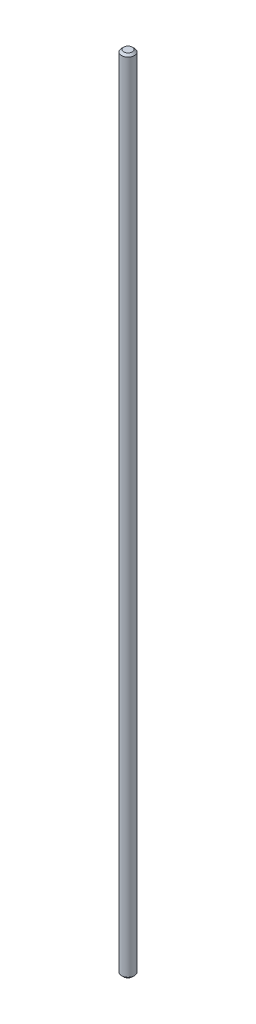
ISO-10303-21;
HEADER;
FILE_DESCRIPTION(('STEP AP214'),'2;1');
FILE_NAME('part.step','',(''),(''),'','','');
FILE_SCHEMA(('AUTOMOTIVE_DESIGN { 1 0 10303 214 1 1 1 1 }'));
ENDSEC;
DATA;
#1=APPLICATION_CONTEXT('core data for automotive mechanical design processes');
#2=APPLICATION_PROTOCOL_DEFINITION('international standard','automotive_design',2000,#1);
#3=PRODUCT_CONTEXT('',#1,'mechanical');
#4=PRODUCT('Part','Part','',(#3));
#5=PRODUCT_RELATED_PRODUCT_CATEGORY('part','',(#4));
#6=PRODUCT_DEFINITION_FORMATION('','',#4);
#7=PRODUCT_DEFINITION_CONTEXT('part definition',#1,'design');
#8=PRODUCT_DEFINITION('design','',#6,#7);
#9=PRODUCT_DEFINITION_SHAPE('','',#8);
#10=(LENGTH_UNIT() NAMED_UNIT(*) SI_UNIT(.MILLI.,.METRE.));
#11=(NAMED_UNIT(*) PLANE_ANGLE_UNIT() SI_UNIT($,.RADIAN.));
#12=(NAMED_UNIT(*) SI_UNIT($,.STERADIAN.) SOLID_ANGLE_UNIT());
#13=UNCERTAINTY_MEASURE_WITH_UNIT(LENGTH_MEASURE(1.E-05),#10,'distance_accuracy_value','');
#14=(GEOMETRIC_REPRESENTATION_CONTEXT(3) GLOBAL_UNCERTAINTY_ASSIGNED_CONTEXT((#13)) GLOBAL_UNIT_ASSIGNED_CONTEXT((#10,
#11,#12)) REPRESENTATION_CONTEXT('',''));
#15=CARTESIAN_POINT('',(0.,0.,0.));
#16=DIRECTION('',(0.,0.,1.));
#17=DIRECTION('',(1.,0.,0.));
#18=AXIS2_PLACEMENT_3D('',#15,#16,#17);
#19=CARTESIAN_POINT('',(0.,375000.,0.));
#20=DIRECTION('',(0.,-1.,0.));
#21=DIRECTION('',(0.,0.,-1.));
#22=AXIS2_PLACEMENT_3D('',#19,#20,#21);
#23=CYLINDRICAL_SURFACE('',#22,3000.);
#24=CARTESIAN_POINT('',(0.,374000.,0.));
#25=DIRECTION('',(0.,1.,0.));
#26=DIRECTION('',(0.,0.,1.));
#27=AXIS2_PLACEMENT_3D('',#24,#25,#26);
#28=CIRCLE('',#27,3000.);
#29=CARTESIAN_POINT('',(0.,374000.,3000.));
#30=VERTEX_POINT('',#29);
#31=EDGE_CURVE('E38',#30,#30,#28,.F.);
#32=ORIENTED_EDGE('',*,*,#31,.T.);
#33=EDGE_LOOP('',(#32));
#34=FACE_BOUND('',#33,.T.);
#35=CARTESIAN_POINT('',(0.,1000.,0.));
#36=DIRECTION('',(0.,1.,0.));
#37=DIRECTION('',(0.,0.,1.));
#38=AXIS2_PLACEMENT_3D('',#35,#36,#37);
#39=CIRCLE('',#38,3000.);
#40=CARTESIAN_POINT('',(0.,1000.,3000.));
#41=VERTEX_POINT('',#40);
#42=EDGE_CURVE('E42',#41,#41,#39,.T.);
#43=ORIENTED_EDGE('',*,*,#42,.T.);
#44=EDGE_LOOP('',(#43));
#45=FACE_BOUND('',#44,.T.);
#46=ADVANCED_FACE('F31',(#34,#45),#23,.T.);
#47=CARTESIAN_POINT('',(0.,375000.,0.));
#48=DIRECTION('',(0.,1.,0.));
#49=DIRECTION('',(0.,0.,1.));
#50=AXIS2_PLACEMENT_3D('',#47,#48,#49);
#51=PLANE('',#50);
#52=CARTESIAN_POINT('',(0.,375000.,0.));
#53=DIRECTION('',(0.,1.,0.));
#54=DIRECTION('',(0.,0.,1.));
#55=AXIS2_PLACEMENT_3D('',#52,#53,#54);
#56=CIRCLE('',#55,1999.99999999994);
#57=CARTESIAN_POINT('',(0.,375000.,1999.99999999994));
#58=VERTEX_POINT('',#57);
#59=EDGE_CURVE('E46',#58,#58,#56,.T.);
#60=ORIENTED_EDGE('',*,*,#59,.T.);
#61=EDGE_LOOP('',(#60));
#62=FACE_BOUND('',#61,.T.);
#63=ADVANCED_FACE('F52',(#62),#51,.T.);
#64=CARTESIAN_POINT('',(0.,0.,0.));
#65=DIRECTION('',(0.,1.,0.));
#66=DIRECTION('',(0.,0.,1.));
#67=AXIS2_PLACEMENT_3D('',#64,#65,#66);
#68=PLANE('',#67);
#69=CARTESIAN_POINT('',(0.,0.,0.));
#70=DIRECTION('',(0.,1.,0.));
#71=DIRECTION('',(0.,0.,1.));
#72=AXIS2_PLACEMENT_3D('',#69,#70,#71);
#73=CIRCLE('',#72,2000.);
#74=CARTESIAN_POINT('',(0.,0.,2000.));
#75=VERTEX_POINT('',#74);
#76=EDGE_CURVE('E10',#75,#75,#73,.F.);
#77=ORIENTED_EDGE('',*,*,#76,.T.);
#78=EDGE_LOOP('',(#77));
#79=FACE_BOUND('',#78,.T.);
#80=ADVANCED_FACE('F56',(#79),#68,.F.);
#81=CARTESIAN_POINT('',(0.,375000.,0.));
#82=DIRECTION('',(0.,-1.,0.));
#83=DIRECTION('',(0.,0.,-1.));
#84=AXIS2_PLACEMENT_3D('',#81,#82,#83);
#85=CONICAL_SURFACE('',#84,1999.99999999994,0.785398163397448);
#86=ORIENTED_EDGE('',*,*,#31,.F.);
#87=EDGE_LOOP('',(#86));
#88=FACE_BOUND('',#87,.T.);
#89=ORIENTED_EDGE('',*,*,#59,.F.);
#90=EDGE_LOOP('',(#89));
#91=FACE_BOUND('',#90,.T.);
#92=ADVANCED_FACE('F54',(#88,#91),#85,.T.);
#93=CARTESIAN_POINT('',(0.,1000.,0.));
#94=DIRECTION('',(0.,1.,0.));
#95=DIRECTION('',(0.,0.,1.));
#96=AXIS2_PLACEMENT_3D('',#93,#94,#95);
#97=CONICAL_SURFACE('',#96,3000.,0.785398163397448);
#98=ORIENTED_EDGE('',*,*,#76,.F.);
#99=EDGE_LOOP('',(#98));
#100=FACE_BOUND('',#99,.T.);
#101=ORIENTED_EDGE('',*,*,#42,.F.);
#102=EDGE_LOOP('',(#101));
#103=FACE_BOUND('',#102,.T.);
#104=ADVANCED_FACE('F33',(#100,#103),#97,.T.);
#105=CLOSED_SHELL('',(#46,#63,#80,#92,#104));
#106=MANIFOLD_SOLID_BREP('B2',#105);
#107=ADVANCED_BREP_SHAPE_REPRESENTATION('',(#18,#106),#14);
#108=SHAPE_DEFINITION_REPRESENTATION(#9,#107);
ENDSEC;
END-ISO-10303-21;
